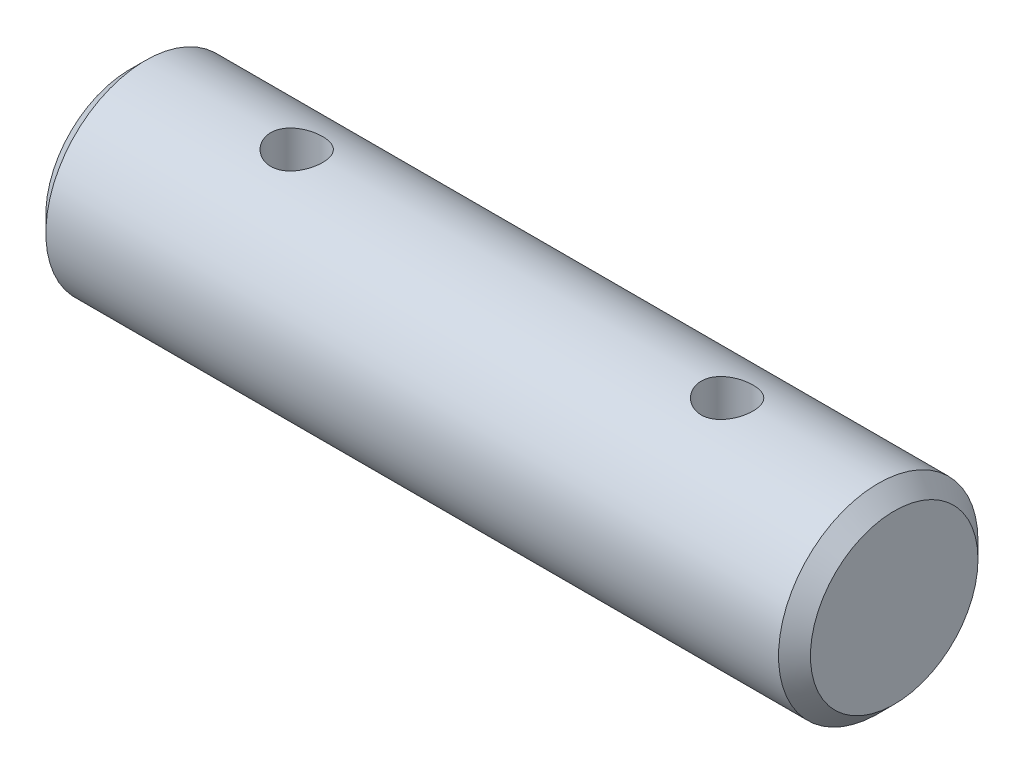
ISO-10303-21;
HEADER;
FILE_DESCRIPTION(('STEP AP214'),'2;1');
FILE_NAME('part.step','',(''),(''),'','','');
FILE_SCHEMA(('AUTOMOTIVE_DESIGN { 1 0 10303 214 1 1 1 1 }'));
ENDSEC;
DATA;
#1=APPLICATION_CONTEXT('core data for automotive mechanical design processes');
#2=APPLICATION_PROTOCOL_DEFINITION('international standard','automotive_design',2000,#1);
#3=PRODUCT_CONTEXT('',#1,'mechanical');
#4=PRODUCT('Part','Part','',(#3));
#5=PRODUCT_RELATED_PRODUCT_CATEGORY('part','',(#4));
#6=PRODUCT_DEFINITION_FORMATION('','',#4);
#7=PRODUCT_DEFINITION_CONTEXT('part definition',#1,'design');
#8=PRODUCT_DEFINITION('design','',#6,#7);
#9=PRODUCT_DEFINITION_SHAPE('','',#8);
#10=(LENGTH_UNIT() NAMED_UNIT(*) SI_UNIT(.MILLI.,.METRE.));
#11=(NAMED_UNIT(*) PLANE_ANGLE_UNIT() SI_UNIT($,.RADIAN.));
#12=(NAMED_UNIT(*) SI_UNIT($,.STERADIAN.) SOLID_ANGLE_UNIT());
#13=UNCERTAINTY_MEASURE_WITH_UNIT(LENGTH_MEASURE(1.E-05),#10,'distance_accuracy_value','');
#14=(GEOMETRIC_REPRESENTATION_CONTEXT(3) GLOBAL_UNCERTAINTY_ASSIGNED_CONTEXT((#13)) GLOBAL_UNIT_ASSIGNED_CONTEXT((#10,
#11,#12)) REPRESENTATION_CONTEXT('',''));
#15=CARTESIAN_POINT('',(0.,0.,0.));
#16=DIRECTION('',(0.,0.,1.));
#17=DIRECTION('',(1.,0.,0.));
#18=AXIS2_PLACEMENT_3D('',#15,#16,#17);
#19=CARTESIAN_POINT('',(47.91,0.,0.));
#20=DIRECTION('',(-1.,0.,0.));
#21=DIRECTION('',(0.,0.,1.));
#22=AXIS2_PLACEMENT_3D('',#19,#20,#21);
#23=CYLINDRICAL_SURFACE('',#22,12.5);
#24=CARTESIAN_POINT('',(-30.22,-12.5,0.));
#25=CARTESIAN_POINT('',(-30.2199954146538,-12.4999971478113,0.179326946679026));
#26=CARTESIAN_POINT('',(-30.2051079426691,-12.4961028524875,0.3587038473682));
#27=CARTESIAN_POINT('',(-30.146050187912,-12.4809455841186,0.712301033744767));
#28=CARTESIAN_POINT('',(-30.1018647958294,-12.4696788090315,0.886518610248366));
#29=CARTESIAN_POINT('',(-29.9857367351544,-12.4410217940273,1.22464113365906));
#30=CARTESIAN_POINT('',(-29.9138288610265,-12.4236392324095,1.38855870935581));
#31=CARTESIAN_POINT('',(-29.7444233670287,-12.3845934444182,1.70200619980628));
#32=CARTESIAN_POINT('',(-29.6469243802715,-12.3629299894065,1.85153534545369));
#33=CARTESIAN_POINT('',(-29.4268252266989,-12.3171304156635,2.13527132315509));
#34=CARTESIAN_POINT('',(-29.3037644017656,-12.2929536884484,2.2691142714999));
#35=CARTESIAN_POINT('',(-29.0370201771188,-12.2451168331656,2.51451354550204));
#36=CARTESIAN_POINT('',(-28.8933342626815,-12.2214567684982,2.62606714954738));
#37=CARTESIAN_POINT('',(-28.5865462781401,-12.176919196352,2.82546970790233));
#38=CARTESIAN_POINT('',(-28.4231670443327,-12.1560930552427,2.91290475811895));
#39=CARTESIAN_POINT('',(-28.0833989801288,-12.1201764521237,3.05892401097991));
#40=CARTESIAN_POINT('',(-27.9070124237655,-12.1050849903616,3.11751324297257));
#41=CARTESIAN_POINT('',(-27.5502551263207,-12.0827649527367,3.20292307224868));
#42=CARTESIAN_POINT('',(-27.3700522113312,-12.075373907484,3.23040120725561));
#43=CARTESIAN_POINT('',(-27.0074544249651,-12.0688057648062,3.2548580741794));
#44=CARTESIAN_POINT('',(-26.8250599470986,-12.0696272141509,3.25184220211874));
#45=CARTESIAN_POINT('',(-26.4683507179147,-12.0792455744299,3.21591974012711));
#46=CARTESIAN_POINT('',(-26.2939497552213,-12.0878315070606,3.18380381846904));
#47=CARTESIAN_POINT('',(-25.9531005261748,-12.1116742484652,3.09185720260272));
#48=CARTESIAN_POINT('',(-25.7866528684561,-12.1269315668694,3.03202439106761));
#49=CARTESIAN_POINT('',(-25.4643500713329,-12.1625867785723,2.88568619200985));
#50=CARTESIAN_POINT('',(-25.3086287821441,-12.1830384228642,2.79889965416121));
#51=CARTESIAN_POINT('',(-25.0136794503183,-12.2267484201133,2.60131388603687));
#52=CARTESIAN_POINT('',(-24.8744545162614,-12.2500073004055,2.49051014104343));
#53=CARTESIAN_POINT('',(-24.6119269504945,-12.2975934138237,2.2439709983854));
#54=CARTESIAN_POINT('',(-24.4892502232203,-12.3219314365829,2.1075702928787));
#55=CARTESIAN_POINT('',(-24.2683878270802,-12.3682867759093,1.81583697916555));
#56=CARTESIAN_POINT('',(-24.1702030314616,-12.3903040097137,1.66050369622162));
#57=CARTESIAN_POINT('',(-24.000854798044,-12.4296616118215,1.33437638254746));
#58=CARTESIAN_POINT('',(-23.9297998955171,-12.4469831160426,1.16352356773748));
#59=CARTESIAN_POINT('',(-23.8175987524097,-12.4748609474232,0.811745654730928));
#60=CARTESIAN_POINT('',(-23.7764463091051,-12.4854186775516,0.630822653799849));
#61=CARTESIAN_POINT('',(-23.7261900452642,-12.4983690711286,0.26938566407214));
#62=CARTESIAN_POINT('',(-23.7162347009844,-12.5009786227301,0.088997669904642));
#63=CARTESIAN_POINT('',(-23.7263101927174,-12.4983598256918,-0.270868895964971));
#64=CARTESIAN_POINT('',(-23.7463380933585,-12.4931322443105,-0.450347554965389));
#65=CARTESIAN_POINT('',(-23.8151116439157,-12.4755662105766,-0.800294154603644));
#66=CARTESIAN_POINT('',(-23.8633865778269,-12.4633443838604,-0.970860991771487));
#67=CARTESIAN_POINT('',(-23.986740878749,-12.4331723926525,-1.30146213816447));
#68=CARTESIAN_POINT('',(-24.0618230741194,-12.4152216237372,-1.46149533390347));
#69=CARTESIAN_POINT('',(-24.2382687737762,-12.3750700691891,-1.76982748004189));
#70=CARTESIAN_POINT('',(-24.340101098214,-12.3527955344451,-1.91784830388041));
#71=CARTESIAN_POINT('',(-24.5665630541568,-12.3065732686746,-2.19500110367974));
#72=CARTESIAN_POINT('',(-24.6911969575744,-12.2826252246339,-2.32412953194741));
#73=CARTESIAN_POINT('',(-24.9636902570839,-12.2349639930819,-2.56338832864094));
#74=CARTESIAN_POINT('',(-25.1120810200617,-12.211274157377,-2.67291924370303));
#75=CARTESIAN_POINT('',(-25.4256325831347,-12.1675189370172,-2.8655324600399));
#76=CARTESIAN_POINT('',(-25.5907926596671,-12.1474533960848,-2.948615901832));
#77=CARTESIAN_POINT('',(-25.9323402621375,-12.1134461121119,-3.08535085594456));
#78=CARTESIAN_POINT('',(-26.1086548450402,-12.0994685123542,-3.13917517756945));
#79=CARTESIAN_POINT('',(-26.4682542870354,-12.0792001170617,-3.21629359303854));
#80=CARTESIAN_POINT('',(-26.6515374601891,-12.0729074743238,-3.23959502364832));
#81=CARTESIAN_POINT('',(-27.0137495842753,-12.0688703284325,-3.25459970033974));
#82=CARTESIAN_POINT('',(-27.1926364300872,-12.0708657774883,-3.24726417322954));
#83=CARTESIAN_POINT('',(-27.5465281633822,-12.082574226948,-3.20342074796939));
#84=CARTESIAN_POINT('',(-27.7215331414828,-12.092287047004,-3.16691353153527));
#85=CARTESIAN_POINT('',(-28.0615506922941,-12.1181850090894,-3.06630741566187));
#86=CARTESIAN_POINT('',(-28.2266244311957,-12.134324548782,-3.00240268203521));
#87=CARTESIAN_POINT('',(-28.5438295760154,-12.1712606098645,-2.84896725299115));
#88=CARTESIAN_POINT('',(-28.6959590407945,-12.1920578280329,-2.75943272285368));
#89=CARTESIAN_POINT('',(-28.987568668172,-12.236695356142,-2.55432532556553));
#90=CARTESIAN_POINT('',(-29.126573785854,-12.2606047089712,-2.43809199732063));
#91=CARTESIAN_POINT('',(-29.3834186869701,-12.3083763684759,-2.18415516194806));
#92=CARTESIAN_POINT('',(-29.5012533690027,-12.3322386624452,-2.04644649484024));
#93=CARTESIAN_POINT('',(-29.7147253652978,-12.3777986967216,-1.7501389973572));
#94=CARTESIAN_POINT('',(-29.8098707589799,-12.3994435037443,-1.59117696762085));
#95=CARTESIAN_POINT('',(-29.9719369983992,-12.4375594949969,-1.25896025374757));
#96=CARTESIAN_POINT('',(-30.0388768242019,-12.4540341564054,-1.08571527504272));
#97=CARTESIAN_POINT('',(-30.1334068419286,-12.4776981257085,-0.760811226558113));
#98=CARTESIAN_POINT('',(-30.1658060175793,-12.4860018232894,-0.610614577182289));
#99=CARTESIAN_POINT('',(-30.2091036062371,-12.4971537393548,-0.306957291465091));
#100=CARTESIAN_POINT('',(-30.2200039248793,-12.5000024413634,-0.153496945633121));
#101=CARTESIAN_POINT('',(-30.22,-12.5,0.));
#102=B_SPLINE_CURVE_WITH_KNOTS('',3,(#24,#25,#26,#27,#28,#29,#30,#31,#32,#33,#34,#35,#36,#37,
#38,#39,#40,#41,#42,#43,#44,#45,#46,#47,#48,#49,#50,#51,#52,#53,#54,#55,#56,#57,#58,#59,#60,#61,
#62,#63,#64,#65,#66,#67,#68,#69,#70,#71,#72,#73,#74,#75,#76,#77,#78,#79,#80,#81,#82,#83,#84,#85,
#86,#87,#88,#89,#90,#91,#92,#93,#94,#95,#96,#97,#98,#99,#100,#101),.UNSPECIFIED.,.T.,.F.,(4,2,2,
2,2,2,2,2,2,2,2,2,2,2,2,2,2,2,2,2,2,2,2,2,2,2,2,2,2,2,2,2,2,2,2,2,2,2,4),(0.,0.537418092583537,
1.0751135543009,1.61213634044737,2.14918781620354,2.69692042150091,3.24471986617448,
3.80140594535331,4.35799493036959,4.90258689837055,5.4470825005821,5.97721335975167,
6.5073847229408,7.04328330310645,7.57928270816354,8.13186573068623,8.68446845245834,
9.23925930210691,9.79393503755475,10.3333328277244,10.8726778140869,11.403281144479,
11.9339404739057,12.4746049011724,13.0153707267156,13.570578149065,14.1257616254791,
14.6776294490601,15.229364596209,15.7639213695285,16.2984656511083,16.8292826709444,
17.3601791529626,17.9059807154984,18.451913622962,19.0087822140113,19.5652754767676,
20.0253254037179,20.485334550515),.UNSPECIFIED.);
#103=CARTESIAN_POINT('',(-30.22,-12.5,0.));
#104=VERTEX_POINT('',#103);
#105=EDGE_CURVE('E10',#104,#104,#102,.T.);
#106=ORIENTED_EDGE('',*,*,#105,.T.);
#107=EDGE_LOOP('',(#106));
#108=FACE_BOUND('',#107,.T.);
#109=CARTESIAN_POINT('',(-26.97,12.0701077045733,3.25));
#110=CARTESIAN_POINT('',(-27.1492114045187,12.0701109573982,3.24999535178112));
#111=CARTESIAN_POINT('',(-27.3284728889145,12.0741425908511,3.23512639697315));
#112=CARTESIAN_POINT('',(-27.6818306976382,12.0897881676305,3.17614884790337));
#113=CARTESIAN_POINT('',(-27.8559242109038,12.1014061612357,3.13202463437074));
#114=CARTESIAN_POINT('',(-28.1937835369768,12.1308216935703,3.01607533822268));
#115=CARTESIAN_POINT('',(-28.3575630347648,12.1486108310136,2.94428790118147));
#116=CARTESIAN_POINT('',(-28.6707764001663,12.188353656464,2.77516657772717));
#117=CARTESIAN_POINT('',(-28.8202093561552,12.210307608853,2.6778310693744));
#118=CARTESIAN_POINT('',(-29.1040422185731,12.2564913332899,2.45790196762269));
#119=CARTESIAN_POINT('',(-29.2380504266685,12.280759850753,2.33481089596256));
#120=CARTESIAN_POINT('',(-29.4837719803068,12.3285031518504,2.0679353457567));
#121=CARTESIAN_POINT('',(-29.5954831088585,12.3519778563636,1.92414881191203));
#122=CARTESIAN_POINT('',(-29.7950602635197,12.3959194289913,1.61726111047983));
#123=CARTESIAN_POINT('',(-29.8825387552971,12.4163352528835,1.45389997653955));
#124=CARTESIAN_POINT('',(-30.0286431803981,12.4514152229145,1.11417056289528));
#125=CARTESIAN_POINT('',(-30.0872737300988,12.4660802892388,0.937804369516634));
#126=CARTESIAN_POINT('',(-30.1727555814258,12.4877324473615,0.581157741498521));
#127=CARTESIAN_POINT('',(-30.2002727320712,12.4948801723699,0.401046821083343));
#128=CARTESIAN_POINT('',(-30.2248395936729,12.5012531662289,0.0386327508821779));
#129=CARTESIAN_POINT('',(-30.2218941617115,12.5004796980681,-0.143670044792211));
#130=CARTESIAN_POINT('',(-30.1860924357162,12.4912159156495,-0.500665123856319));
#131=CARTESIAN_POINT('',(-30.1539552567017,12.4829111371108,-0.675435069867299));
#132=CARTESIAN_POINT('',(-30.0618416591648,12.4597356136684,-1.0170108145033));
#133=CARTESIAN_POINT('',(-30.0018636941121,12.4448645040133,-1.18381617013483));
#134=CARTESIAN_POINT('',(-29.8552075020046,12.4099485405509,-1.50658740876953));
#135=CARTESIAN_POINT('',(-29.7682790211492,12.3898554928598,-1.66243415738995));
#136=CARTESIAN_POINT('',(-29.5703805240032,12.3466665928588,-1.95757621832139));
#137=CARTESIAN_POINT('',(-29.4594060240386,12.3235701808565,-2.0968684363271));
#138=CARTESIAN_POINT('',(-29.2127328136793,12.2760868825507,-2.35923845302994));
#139=CARTESIAN_POINT('',(-29.07640638264,12.2516820085968,-2.48172349723347));
#140=CARTESIAN_POINT('',(-28.7848939748638,12.2049448337488,-2.70223285928799));
#141=CARTESIAN_POINT('',(-28.6297069629822,12.1826126467309,-2.80025583365962));
#142=CARTESIAN_POINT('',(-28.3036433764868,12.1424802811445,-2.96948026869846));
#143=CARTESIAN_POINT('',(-28.1326836581614,12.1247062331819,-3.04052815701658));
#144=CARTESIAN_POINT('',(-27.7806702032995,12.0960312749224,-3.15268381624371));
#145=CARTESIAN_POINT('',(-27.5996188394296,12.0851287564037,-3.19379859308707));
#146=CARTESIAN_POINT('',(-27.2380861898992,12.0717718519798,-3.24391476190107));
#147=CARTESIAN_POINT('',(-27.0577354566334,12.0690857581667,-3.25379719756266));
#148=CARTESIAN_POINT('',(-26.6979597985042,12.0718332019216,-3.24358933567581));
#149=CARTESIAN_POINT('',(-26.5185347824144,12.0772659234555,-3.22350205042832));
#150=CARTESIAN_POINT('',(-26.1690480156728,12.0954157697153,-3.15469998588876));
#151=CARTESIAN_POINT('',(-25.9988757610158,12.1079997596083,-3.10650801182698));
#152=CARTESIAN_POINT('',(-25.6690276420575,12.1389056713158,-2.98344905344028));
#153=CARTESIAN_POINT('',(-25.5093531006332,12.1572283146206,-2.90857871482455));
#154=CARTESIAN_POINT('',(-25.2013277498111,12.1980276011193,-2.73247717350929));
#155=CARTESIAN_POINT('',(-25.0532856479729,12.2205834904775,-2.6307247762517));
#156=CARTESIAN_POINT('',(-24.7760537510078,12.2671181282773,-2.4043987998912));
#157=CARTESIAN_POINT('',(-24.6468673255122,12.2910971299641,-2.27982115071729));
#158=CARTESIAN_POINT('',(-24.4073926308157,12.3385688083207,-2.00731864410625));
#159=CARTESIAN_POINT('',(-24.2977167737063,12.3620303224023,-1.85884911980557));
#160=CARTESIAN_POINT('',(-24.1048486705344,12.4051491994823,-1.54509249859946));
#161=CARTESIAN_POINT('',(-24.0216550211151,12.4248067640396,-1.37980629346376));
#162=CARTESIAN_POINT('',(-23.8848614036657,12.4579769251599,-1.03826690311395));
#163=CARTESIAN_POINT('',(-23.8310432136005,12.471534699114,-0.862105718034379));
#164=CARTESIAN_POINT('',(-23.7538854847522,12.4911761164616,-0.502837049160069));
#165=CARTESIAN_POINT('',(-23.7305395491013,12.4972613285118,-0.31973103156275));
#166=CARTESIAN_POINT('',(-23.7153732348059,12.5012019892906,0.0424954133206593));
#167=CARTESIAN_POINT('',(-23.7226523567699,12.4992925217517,0.221576127725297));
#168=CARTESIAN_POINT('',(-23.7664501847207,12.4879858018465,0.575871036634166));
#169=CARTESIAN_POINT('',(-23.8029678881064,12.4785888062303,0.751085363506482));
#170=CARTESIAN_POINT('',(-23.9037074686778,12.4534054132527,1.09164766573276));
#171=CARTESIAN_POINT('',(-23.9677546853962,12.4376593358795,1.257050484072));
#172=CARTESIAN_POINT('',(-24.1215784955814,12.4014288567053,1.57485660758887));
#173=CARTESIAN_POINT('',(-24.2113585550517,12.3809438166767,1.7272581580113));
#174=CARTESIAN_POINT('',(-24.4167801344324,12.3367798925157,2.01895989700419));
#175=CARTESIAN_POINT('',(-24.5330244304409,12.3130327153406,2.157825244317));
#176=CARTESIAN_POINT('',(-24.7869204985927,12.2653095573743,2.41438331885253));
#177=CARTESIAN_POINT('',(-24.9245778083502,12.2413335189069,2.53207055217988));
#178=CARTESIAN_POINT('',(-25.2208069686741,12.1953008053636,2.74532550015591));
#179=CARTESIAN_POINT('',(-25.3797514328088,12.1732938799442,2.84038727425697));
#180=CARTESIAN_POINT('',(-25.7119180734604,12.1343795273366,3.0023016148278));
#181=CARTESIAN_POINT('',(-25.8851303809124,12.1174686123345,3.06917348760504));
#182=CARTESIAN_POINT('',(-26.209870305795,12.0931300782527,3.1635630612591));
#183=CARTESIAN_POINT('',(-26.3599285821244,12.0845645189861,3.19590306708417));
#184=CARTESIAN_POINT('',(-26.6633125697311,12.0730522257395,3.23912243522353));
#185=CARTESIAN_POINT('',(-26.8166379474639,12.070104920934,3.25000397776241));
#186=CARTESIAN_POINT('',(-26.97,12.0701077045733,3.25));
#187=B_SPLINE_CURVE_WITH_KNOTS('',3,(#109,#110,#111,#112,#113,#114,#115,#116,#117,#118,#119,
#120,#121,#122,#123,#124,#125,#126,#127,#128,#129,#130,#131,#132,#133,#134,#135,#136,#137,#138,
#139,#140,#141,#142,#143,#144,#145,#146,#147,#148,#149,#150,#151,#152,#153,#154,#155,#156,#157,
#158,#159,#160,#161,#162,#163,#164,#165,#166,#167,#168,#169,#170,#171,#172,#173,#174,#175,#176,
#177,#178,#179,#180,#181,#182,#183,#184,#185,#186),.UNSPECIFIED.,.T.,.F.,(4,2,2,2,2,2,2,2,2,2,2,
2,2,2,2,2,2,2,2,2,2,2,2,2,2,2,2,2,2,2,2,2,2,2,2,2,2,2,4),(0.,0.537070585366156,1.07442814181089,
1.61105700156232,2.14771993786827,2.69590642873233,3.24414739847249,3.80070711961764,
4.35717774859144,4.9014997027847,5.44573486933552,5.97691640068849,6.50812744222305,
7.04442685876537,7.58082636107376,8.13290034432249,8.68500464131248,9.24020661254798,
9.79527859528771,10.3345457987712,10.8737588033625,11.4032475650856,11.9328029233325,
12.4734934119641,13.0142804074904,13.5698352862046,14.125360719806,14.6767011108399,
15.2279257434831,15.7630571972261,16.2981703019111,16.8299373742635,17.3617761049811,
17.9072189278757,18.4528030428377,19.0096330020193,19.5660809852347,20.0257315159239,
20.4853353427545),.UNSPECIFIED.);
#188=CARTESIAN_POINT('',(-26.97,12.0701077045733,3.25));
#189=VERTEX_POINT('',#188);
#190=EDGE_CURVE('E59',#189,#189,#187,.T.);
#191=ORIENTED_EDGE('',*,*,#190,.T.);
#192=EDGE_LOOP('',(#191));
#193=FACE_BOUND('',#192,.T.);
#194=CARTESIAN_POINT('',(23.72,-12.5,0.));
#195=CARTESIAN_POINT('',(23.7200045853461,-12.4999971478113,0.179326946679026));
#196=CARTESIAN_POINT('',(23.7348920573309,-12.4961028524875,0.358703847368199));
#197=CARTESIAN_POINT('',(23.793949812088,-12.4809455841186,0.712301033744766));
#198=CARTESIAN_POINT('',(23.8381352041706,-12.4696788090315,0.886518610248366));
#199=CARTESIAN_POINT('',(23.9542632648456,-12.4410217940273,1.22464113365906));
#200=CARTESIAN_POINT('',(24.0261711389735,-12.4236392324095,1.38855870935581));
#201=CARTESIAN_POINT('',(24.1955766329713,-12.3845934444182,1.70200619980628));
#202=CARTESIAN_POINT('',(24.2930756197285,-12.3629299894065,1.85153534545369));
#203=CARTESIAN_POINT('',(24.5131747733011,-12.3171304156635,2.13527132315509));
#204=CARTESIAN_POINT('',(24.6362355982344,-12.2929536884484,2.2691142714999));
#205=CARTESIAN_POINT('',(24.9029798228812,-12.2451168331656,2.51451354550204));
#206=CARTESIAN_POINT('',(25.0466657373185,-12.2214567684982,2.62606714954738));
#207=CARTESIAN_POINT('',(25.3534537218599,-12.176919196352,2.82546970790233));
#208=CARTESIAN_POINT('',(25.5168329556673,-12.1560930552427,2.91290475811895));
#209=CARTESIAN_POINT('',(25.8566010198712,-12.1201764521237,3.05892401097991));
#210=CARTESIAN_POINT('',(26.0329875762345,-12.1050849903616,3.11751324297257));
#211=CARTESIAN_POINT('',(26.3897448736793,-12.0827649527367,3.20292307224868));
#212=CARTESIAN_POINT('',(26.5699477886688,-12.075373907484,3.23040120725561));
#213=CARTESIAN_POINT('',(26.9325455750349,-12.0688057648062,3.2548580741794));
#214=CARTESIAN_POINT('',(27.1149400529014,-12.0696272141509,3.25184220211874));
#215=CARTESIAN_POINT('',(27.4716492820853,-12.0792455744299,3.21591974012711));
#216=CARTESIAN_POINT('',(27.6460502447787,-12.0878315070606,3.18380381846904));
#217=CARTESIAN_POINT('',(27.9868994738252,-12.1116742484652,3.09185720260272));
#218=CARTESIAN_POINT('',(28.1533471315439,-12.1269315668694,3.03202439106761));
#219=CARTESIAN_POINT('',(28.4756499286671,-12.1625867785723,2.88568619200985));
#220=CARTESIAN_POINT('',(28.6313712178559,-12.1830384228642,2.79889965416121));
#221=CARTESIAN_POINT('',(28.9263205496817,-12.2267484201133,2.60131388603687));
#222=CARTESIAN_POINT('',(29.0655454837385,-12.2500073004055,2.49051014104343));
#223=CARTESIAN_POINT('',(29.3280730495055,-12.2975934138237,2.2439709983854));
#224=CARTESIAN_POINT('',(29.4507497767797,-12.3219314365829,2.1075702928787));
#225=CARTESIAN_POINT('',(29.6716121729198,-12.3682867759093,1.81583697916555));
#226=CARTESIAN_POINT('',(29.7697969685384,-12.3903040097137,1.66050369622162));
#227=CARTESIAN_POINT('',(29.9391452019559,-12.4296616118215,1.33437638254746));
#228=CARTESIAN_POINT('',(30.0102001044829,-12.4469831160426,1.16352356773748));
#229=CARTESIAN_POINT('',(30.1224012475903,-12.4748609474232,0.811745654730928));
#230=CARTESIAN_POINT('',(30.1635536908948,-12.4854186775516,0.630822653799849));
#231=CARTESIAN_POINT('',(30.2138099547358,-12.4983690711286,0.26938566407214));
#232=CARTESIAN_POINT('',(30.2237652990155,-12.5009786227301,0.088997669904642));
#233=CARTESIAN_POINT('',(30.2136898072826,-12.4983598256918,-0.270868895964971));
#234=CARTESIAN_POINT('',(30.1936619066415,-12.4931322443105,-0.450347554965389));
#235=CARTESIAN_POINT('',(30.1248883560843,-12.4755662105766,-0.800294154603644));
#236=CARTESIAN_POINT('',(30.0766134221731,-12.4633443838604,-0.970860991771487));
#237=CARTESIAN_POINT('',(29.953259121251,-12.4331723926525,-1.30146213816447));
#238=CARTESIAN_POINT('',(29.8781769258806,-12.4152216237372,-1.46149533390347));
#239=CARTESIAN_POINT('',(29.7017312262237,-12.3750700691891,-1.76982748004189));
#240=CARTESIAN_POINT('',(29.599898901786,-12.3527955344451,-1.91784830388041));
#241=CARTESIAN_POINT('',(29.3734369458432,-12.3065732686746,-2.19500110367974));
#242=CARTESIAN_POINT('',(29.2488030424256,-12.2826252246339,-2.32412953194741));
#243=CARTESIAN_POINT('',(28.9763097429161,-12.2349639930819,-2.56338832864094));
#244=CARTESIAN_POINT('',(28.8279189799383,-12.211274157377,-2.67291924370303));
#245=CARTESIAN_POINT('',(28.5143674168653,-12.1675189370172,-2.8655324600399));
#246=CARTESIAN_POINT('',(28.3492073403329,-12.1474533960848,-2.948615901832));
#247=CARTESIAN_POINT('',(28.0076597378625,-12.1134461121119,-3.08535085594456));
#248=CARTESIAN_POINT('',(27.8313451549598,-12.0994685123542,-3.13917517756945));
#249=CARTESIAN_POINT('',(27.4717457129646,-12.0792001170617,-3.21629359303854));
#250=CARTESIAN_POINT('',(27.2884625398109,-12.0729074743238,-3.23959502364832));
#251=CARTESIAN_POINT('',(26.9262504157247,-12.0688703284325,-3.25459970033974));
#252=CARTESIAN_POINT('',(26.7473635699128,-12.0708657774883,-3.24726417322954));
#253=CARTESIAN_POINT('',(26.3934718366178,-12.082574226948,-3.20342074796939));
#254=CARTESIAN_POINT('',(26.2184668585172,-12.092287047004,-3.16691353153527));
#255=CARTESIAN_POINT('',(25.8784493077059,-12.1181850090894,-3.06630741566187));
#256=CARTESIAN_POINT('',(25.7133755688043,-12.134324548782,-3.00240268203521));
#257=CARTESIAN_POINT('',(25.3961704239846,-12.1712606098645,-2.84896725299114));
#258=CARTESIAN_POINT('',(25.2440409592055,-12.1920578280329,-2.75943272285368));
#259=CARTESIAN_POINT('',(24.952431331828,-12.236695356142,-2.55432532556553));
#260=CARTESIAN_POINT('',(24.813426214146,-12.2606047089712,-2.43809199732062));
#261=CARTESIAN_POINT('',(24.5565813130299,-12.3083763684759,-2.18415516194806));
#262=CARTESIAN_POINT('',(24.4387466309973,-12.3322386624452,-2.04644649484024));
#263=CARTESIAN_POINT('',(24.2252746347022,-12.3777986967216,-1.7501389973572));
#264=CARTESIAN_POINT('',(24.1301292410201,-12.3994435037443,-1.59117696762085));
#265=CARTESIAN_POINT('',(23.9680630016008,-12.4375594949969,-1.25896025374757));
#266=CARTESIAN_POINT('',(23.901123175798,-12.4540341564054,-1.08571527504272));
#267=CARTESIAN_POINT('',(23.8065931580713,-12.4776981257085,-0.760811226558113));
#268=CARTESIAN_POINT('',(23.7741939824207,-12.4860018232894,-0.610614577182289));
#269=CARTESIAN_POINT('',(23.7308963937629,-12.4971537393548,-0.306957291465091));
#270=CARTESIAN_POINT('',(23.7199960751207,-12.5000024413634,-0.153496945633121));
#271=CARTESIAN_POINT('',(23.72,-12.5,0.));
#272=B_SPLINE_CURVE_WITH_KNOTS('',3,(#194,#195,#196,#197,#198,#199,#200,#201,#202,#203,#204,
#205,#206,#207,#208,#209,#210,#211,#212,#213,#214,#215,#216,#217,#218,#219,#220,#221,#222,#223,
#224,#225,#226,#227,#228,#229,#230,#231,#232,#233,#234,#235,#236,#237,#238,#239,#240,#241,#242,
#243,#244,#245,#246,#247,#248,#249,#250,#251,#252,#253,#254,#255,#256,#257,#258,#259,#260,#261,
#262,#263,#264,#265,#266,#267,#268,#269,#270,#271),.UNSPECIFIED.,.T.,.F.,(4,2,2,2,2,2,2,2,2,2,2,
2,2,2,2,2,2,2,2,2,2,2,2,2,2,2,2,2,2,2,2,2,2,2,2,2,2,2,4),(0.,0.537418092583536,1.0751135543009,
1.61213634044737,2.14918781620354,2.69692042150091,3.24471986617448,3.80140594535331,
4.35799493036959,4.90258689837055,5.4470825005821,5.97721335975167,6.5073847229408,
7.04328330310645,7.57928270816354,8.13186573068623,8.68446845245834,9.23925930210691,
9.79393503755475,10.3333328277244,10.8726778140869,11.403281144479,11.9339404739057,
12.4746049011724,13.0153707267156,13.570578149065,14.1257616254791,14.6776294490601,
15.229364596209,15.7639213695285,16.2984656511083,16.8292826709444,17.3601791529626,
17.9059807154984,18.451913622962,19.0087822140113,19.5652754767676,20.0253254037179,
20.485334550515),.UNSPECIFIED.);
#273=CARTESIAN_POINT('',(23.72,-12.5,0.));
#274=VERTEX_POINT('',#273);
#275=EDGE_CURVE('E64',#274,#274,#272,.T.);
#276=ORIENTED_EDGE('',*,*,#275,.T.);
#277=EDGE_LOOP('',(#276));
#278=FACE_BOUND('',#277,.T.);
#279=CARTESIAN_POINT('',(26.97,12.0701077045733,3.25));
#280=CARTESIAN_POINT('',(26.7907885954813,12.0701109573982,3.24999535178112));
#281=CARTESIAN_POINT('',(26.6115271110855,12.0741425908511,3.23512639697315));
#282=CARTESIAN_POINT('',(26.2581693023618,12.0897881676305,3.17614884790337));
#283=CARTESIAN_POINT('',(26.0840757890962,12.1014061612357,3.13202463437075));
#284=CARTESIAN_POINT('',(25.7462164630232,12.1308216935703,3.01607533822268));
#285=CARTESIAN_POINT('',(25.5824369652352,12.1486108310136,2.94428790118147));
#286=CARTESIAN_POINT('',(25.2692235998337,12.188353656464,2.77516657772717));
#287=CARTESIAN_POINT('',(25.1197906438448,12.210307608853,2.6778310693744));
#288=CARTESIAN_POINT('',(24.8359577814269,12.2564913332899,2.45790196762269));
#289=CARTESIAN_POINT('',(24.7019495733315,12.280759850753,2.33481089596256));
#290=CARTESIAN_POINT('',(24.4562280196932,12.3285031518504,2.0679353457567));
#291=CARTESIAN_POINT('',(24.3445168911414,12.3519778563636,1.92414881191203));
#292=CARTESIAN_POINT('',(24.1449397364803,12.3959194289913,1.61726111047983));
#293=CARTESIAN_POINT('',(24.0574612447029,12.4163352528835,1.45389997653954));
#294=CARTESIAN_POINT('',(23.9113568196019,12.4514152229145,1.11417056289528));
#295=CARTESIAN_POINT('',(23.8527262699012,12.4660802892388,0.937804369516633));
#296=CARTESIAN_POINT('',(23.7672444185742,12.4877324473615,0.581157741498521));
#297=CARTESIAN_POINT('',(23.7397272679288,12.4948801723699,0.401046821083343));
#298=CARTESIAN_POINT('',(23.7151604063271,12.5012531662289,0.0386327508821782));
#299=CARTESIAN_POINT('',(23.7181058382884,12.5004796980681,-0.143670044792211));
#300=CARTESIAN_POINT('',(23.7539075642838,12.4912159156495,-0.500665123856319));
#301=CARTESIAN_POINT('',(23.7860447432983,12.4829111371108,-0.675435069867299));
#302=CARTESIAN_POINT('',(23.8781583408352,12.4597356136684,-1.0170108145033));
#303=CARTESIAN_POINT('',(23.9381363058879,12.4448645040133,-1.18381617013483));
#304=CARTESIAN_POINT('',(24.0847924979954,12.4099485405509,-1.50658740876953));
#305=CARTESIAN_POINT('',(24.1717209788508,12.3898554928598,-1.66243415738995));
#306=CARTESIAN_POINT('',(24.3696194759968,12.3466665928588,-1.95757621832139));
#307=CARTESIAN_POINT('',(24.4805939759614,12.3235701808565,-2.0968684363271));
#308=CARTESIAN_POINT('',(24.7272671863206,12.2760868825507,-2.35923845302994));
#309=CARTESIAN_POINT('',(24.8635936173599,12.2516820085968,-2.48172349723347));
#310=CARTESIAN_POINT('',(25.1551060251362,12.2049448337488,-2.70223285928799));
#311=CARTESIAN_POINT('',(25.3102930370178,12.1826126467309,-2.80025583365962));
#312=CARTESIAN_POINT('',(25.6363566235132,12.1424802811445,-2.96948026869846));
#313=CARTESIAN_POINT('',(25.8073163418386,12.1247062331819,-3.04052815701658));
#314=CARTESIAN_POINT('',(26.1593297967005,12.0960312749224,-3.15268381624371));
#315=CARTESIAN_POINT('',(26.3403811605704,12.0851287564037,-3.19379859308707));
#316=CARTESIAN_POINT('',(26.7019138101008,12.0717718519798,-3.24391476190107));
#317=CARTESIAN_POINT('',(26.8822645433665,12.0690857581667,-3.25379719756266));
#318=CARTESIAN_POINT('',(27.2420402014958,12.0718332019216,-3.24358933567581));
#319=CARTESIAN_POINT('',(27.4214652175856,12.0772659234555,-3.22350205042832));
#320=CARTESIAN_POINT('',(27.7709519843272,12.0954157697153,-3.15469998588876));
#321=CARTESIAN_POINT('',(27.9411242389842,12.1079997596083,-3.10650801182698));
#322=CARTESIAN_POINT('',(28.2709723579425,12.1389056713158,-2.98344905344028));
#323=CARTESIAN_POINT('',(28.4306468993668,12.1572283146206,-2.90857871482455));
#324=CARTESIAN_POINT('',(28.7386722501889,12.1980276011193,-2.73247717350929));
#325=CARTESIAN_POINT('',(28.8867143520271,12.2205834904775,-2.6307247762517));
#326=CARTESIAN_POINT('',(29.1639462489922,12.2671181282773,-2.4043987998912));
#327=CARTESIAN_POINT('',(29.2931326744878,12.2910971299641,-2.27982115071729));
#328=CARTESIAN_POINT('',(29.5326073691842,12.3385688083207,-2.00731864410625));
#329=CARTESIAN_POINT('',(29.6422832262937,12.3620303224023,-1.85884911980557));
#330=CARTESIAN_POINT('',(29.8351513294656,12.4051491994823,-1.54509249859946));
#331=CARTESIAN_POINT('',(29.9183449788849,12.4248067640396,-1.37980629346376));
#332=CARTESIAN_POINT('',(30.0551385963343,12.4579769251599,-1.03826690311395));
#333=CARTESIAN_POINT('',(30.1089567863995,12.471534699114,-0.862105718034378));
#334=CARTESIAN_POINT('',(30.1861145152478,12.4911761164616,-0.502837049160068));
#335=CARTESIAN_POINT('',(30.2094604508987,12.4972613285118,-0.319731031562749));
#336=CARTESIAN_POINT('',(30.2246267651941,12.5012019892906,0.0424954133206593));
#337=CARTESIAN_POINT('',(30.2173476432301,12.4992925217517,0.221576127725297));
#338=CARTESIAN_POINT('',(30.1735498152793,12.4879858018465,0.575871036634166));
#339=CARTESIAN_POINT('',(30.1370321118936,12.4785888062303,0.751085363506482));
#340=CARTESIAN_POINT('',(30.0362925313222,12.4534054132527,1.09164766573276));
#341=CARTESIAN_POINT('',(29.9722453146038,12.4376593358795,1.257050484072));
#342=CARTESIAN_POINT('',(29.8184215044186,12.4014288567053,1.57485660758887));
#343=CARTESIAN_POINT('',(29.7286414449483,12.3809438166767,1.7272581580113));
#344=CARTESIAN_POINT('',(29.5232198655676,12.3367798925157,2.01895989700419));
#345=CARTESIAN_POINT('',(29.4069755695591,12.3130327153406,2.15782524431701));
#346=CARTESIAN_POINT('',(29.1530795014073,12.2653095573743,2.41438331885253));
#347=CARTESIAN_POINT('',(29.0154221916498,12.2413335189069,2.53207055217988));
#348=CARTESIAN_POINT('',(28.7191930313259,12.1953008053636,2.74532550015591));
#349=CARTESIAN_POINT('',(28.5602485671912,12.1732938799442,2.84038727425697));
#350=CARTESIAN_POINT('',(28.2280819265396,12.1343795273366,3.0023016148278));
#351=CARTESIAN_POINT('',(28.0548696190875,12.1174686123345,3.06917348760504));
#352=CARTESIAN_POINT('',(27.730129694205,12.0931300782527,3.1635630612591));
#353=CARTESIAN_POINT('',(27.5800714178756,12.0845645189861,3.19590306708417));
#354=CARTESIAN_POINT('',(27.2766874302689,12.0730522257395,3.23912243522353));
#355=CARTESIAN_POINT('',(27.123362052536,12.070104920934,3.25000397776241));
#356=CARTESIAN_POINT('',(26.97,12.0701077045733,3.25));
#357=B_SPLINE_CURVE_WITH_KNOTS('',3,(#279,#280,#281,#282,#283,#284,#285,#286,#287,#288,#289,
#290,#291,#292,#293,#294,#295,#296,#297,#298,#299,#300,#301,#302,#303,#304,#305,#306,#307,#308,
#309,#310,#311,#312,#313,#314,#315,#316,#317,#318,#319,#320,#321,#322,#323,#324,#325,#326,#327,
#328,#329,#330,#331,#332,#333,#334,#335,#336,#337,#338,#339,#340,#341,#342,#343,#344,#345,#346,
#347,#348,#349,#350,#351,#352,#353,#354,#355,#356),.UNSPECIFIED.,.T.,.F.,(4,2,2,2,2,2,2,2,2,2,2,
2,2,2,2,2,2,2,2,2,2,2,2,2,2,2,2,2,2,2,2,2,2,2,2,2,2,2,4),(0.,0.537070585366156,1.07442814181089,
1.61105700156232,2.14771993786827,2.69590642873233,3.24414739847249,3.80070711961764,
4.35717774859144,4.9014997027847,5.44573486933552,5.97691640068849,6.50812744222306,
7.04442685876537,7.58082636107376,8.13290034432249,8.68500464131248,9.24020661254798,
9.79527859528771,10.3345457987712,10.8737588033625,11.4032475650856,11.9328029233325,
12.4734934119641,13.0142804074904,13.5698352862046,14.125360719806,14.6767011108399,
15.2279257434831,15.7630571972261,16.2981703019111,16.8299373742635,17.3617761049811,
17.9072189278757,18.4528030428377,19.0096330020193,19.5660809852347,20.0257315159239,
20.4853353427545),.UNSPECIFIED.);
#358=CARTESIAN_POINT('',(26.97,12.0701077045733,3.25));
#359=VERTEX_POINT('',#358);
#360=EDGE_CURVE('E69',#359,#359,#357,.T.);
#361=ORIENTED_EDGE('',*,*,#360,.T.);
#362=EDGE_LOOP('',(#361));
#363=FACE_BOUND('',#362,.T.);
#364=CARTESIAN_POINT('',(-45.91,0.,0.));
#365=DIRECTION('',(1.,0.,0.));
#366=DIRECTION('',(0.,0.,-1.));
#367=AXIS2_PLACEMENT_3D('',#364,#365,#366);
#368=CIRCLE('',#367,12.5);
#369=CARTESIAN_POINT('',(-45.91,0.,-12.5));
#370=VERTEX_POINT('',#369);
#371=EDGE_CURVE('E107',#370,#370,#368,.T.);
#372=ORIENTED_EDGE('',*,*,#371,.T.);
#373=EDGE_LOOP('',(#372));
#374=FACE_BOUND('',#373,.T.);
#375=CARTESIAN_POINT('',(45.91,0.,0.));
#376=DIRECTION('',(1.,0.,0.));
#377=DIRECTION('',(0.,0.,-1.));
#378=AXIS2_PLACEMENT_3D('',#375,#376,#377);
#379=CIRCLE('',#378,12.5);
#380=CARTESIAN_POINT('',(45.91,0.,-12.5));
#381=VERTEX_POINT('',#380);
#382=EDGE_CURVE('E111',#381,#381,#379,.F.);
#383=ORIENTED_EDGE('',*,*,#382,.T.);
#384=EDGE_LOOP('',(#383));
#385=FACE_BOUND('',#384,.T.);
#386=ADVANCED_FACE('F45',(#108,#193,#278,#363,#374,#385),#23,.T.);
#387=CARTESIAN_POINT('',(47.91,0.,0.));
#388=DIRECTION('',(1.,0.,0.));
#389=DIRECTION('',(0.,0.,-1.));
#390=AXIS2_PLACEMENT_3D('',#387,#388,#389);
#391=PLANE('',#390);
#392=CARTESIAN_POINT('',(47.91,0.,0.));
#393=DIRECTION('',(1.,0.,0.));
#394=DIRECTION('',(0.,0.,-1.));
#395=AXIS2_PLACEMENT_3D('',#392,#393,#394);
#396=CIRCLE('',#395,10.5);
#397=CARTESIAN_POINT('',(47.91,0.,-10.5));
#398=VERTEX_POINT('',#397);
#399=EDGE_CURVE('E99',#398,#398,#396,.T.);
#400=ORIENTED_EDGE('',*,*,#399,.T.);
#401=EDGE_LOOP('',(#400));
#402=FACE_BOUND('',#401,.T.);
#403=ADVANCED_FACE('F91',(#402),#391,.T.);
#404=CARTESIAN_POINT('',(-47.91,0.,0.));
#405=DIRECTION('',(1.,0.,0.));
#406=DIRECTION('',(0.,0.,-1.));
#407=AXIS2_PLACEMENT_3D('',#404,#405,#406);
#408=PLANE('',#407);
#409=CARTESIAN_POINT('',(-47.91,0.,0.));
#410=DIRECTION('',(1.,0.,0.));
#411=DIRECTION('',(0.,0.,-1.));
#412=AXIS2_PLACEMENT_3D('',#409,#410,#411);
#413=CIRCLE('',#412,10.5);
#414=CARTESIAN_POINT('',(-47.91,0.,-10.5));
#415=VERTEX_POINT('',#414);
#416=EDGE_CURVE('E103',#415,#415,#413,.F.);
#417=ORIENTED_EDGE('',*,*,#416,.T.);
#418=EDGE_LOOP('',(#417));
#419=FACE_BOUND('',#418,.T.);
#420=ADVANCED_FACE('F123',(#419),#408,.F.);
#421=CARTESIAN_POINT('',(-45.91,0.,0.));
#422=DIRECTION('',(1.,0.,0.));
#423=DIRECTION('',(0.,0.,-1.));
#424=AXIS2_PLACEMENT_3D('',#421,#422,#423);
#425=CONICAL_SURFACE('',#424,12.5,0.785398163397449);
#426=ORIENTED_EDGE('',*,*,#416,.F.);
#427=EDGE_LOOP('',(#426));
#428=FACE_BOUND('',#427,.T.);
#429=ORIENTED_EDGE('',*,*,#371,.F.);
#430=EDGE_LOOP('',(#429));
#431=FACE_BOUND('',#430,.T.);
#432=ADVANCED_FACE('F119',(#428,#431),#425,.T.);
#433=CARTESIAN_POINT('',(47.91,0.,0.));
#434=DIRECTION('',(-1.,0.,0.));
#435=DIRECTION('',(0.,0.,1.));
#436=AXIS2_PLACEMENT_3D('',#433,#434,#435);
#437=CONICAL_SURFACE('',#436,10.5,0.785398163397451);
#438=ORIENTED_EDGE('',*,*,#382,.F.);
#439=EDGE_LOOP('',(#438));
#440=FACE_BOUND('',#439,.T.);
#441=ORIENTED_EDGE('',*,*,#399,.F.);
#442=EDGE_LOOP('',(#441));
#443=FACE_BOUND('',#442,.T.);
#444=ADVANCED_FACE('F48',(#440,#443),#437,.T.);
#445=CARTESIAN_POINT('',(26.97,-12.5,0.));
#446=DIRECTION('',(0.,1.,0.));
#447=DIRECTION('',(0.,0.,1.));
#448=AXIS2_PLACEMENT_3D('',#445,#446,#447);
#449=CYLINDRICAL_SURFACE('',#448,3.25);
#450=ORIENTED_EDGE('',*,*,#360,.F.);
#451=EDGE_LOOP('',(#450));
#452=FACE_BOUND('',#451,.T.);
#453=ORIENTED_EDGE('',*,*,#275,.F.);
#454=EDGE_LOOP('',(#453));
#455=FACE_BOUND('',#454,.T.);
#456=ADVANCED_FACE('F84',(#452,#455),#449,.F.);
#457=CARTESIAN_POINT('',(-26.97,-12.5,0.));
#458=DIRECTION('',(0.,1.,0.));
#459=DIRECTION('',(0.,0.,1.));
#460=AXIS2_PLACEMENT_3D('',#457,#458,#459);
#461=CYLINDRICAL_SURFACE('',#460,3.25);
#462=ORIENTED_EDGE('',*,*,#190,.F.);
#463=EDGE_LOOP('',(#462));
#464=FACE_BOUND('',#463,.T.);
#465=ORIENTED_EDGE('',*,*,#105,.F.);
#466=EDGE_LOOP('',(#465));
#467=FACE_BOUND('',#466,.T.);
#468=ADVANCED_FACE('F81',(#464,#467),#461,.F.);
#469=CLOSED_SHELL('',(#386,#403,#420,#432,#444,#456,#468));
#470=MANIFOLD_SOLID_BREP('B2',#469);
#471=ADVANCED_BREP_SHAPE_REPRESENTATION('',(#18,#470),#14);
#472=SHAPE_DEFINITION_REPRESENTATION(#9,#471);
ENDSEC;
END-ISO-10303-21;
